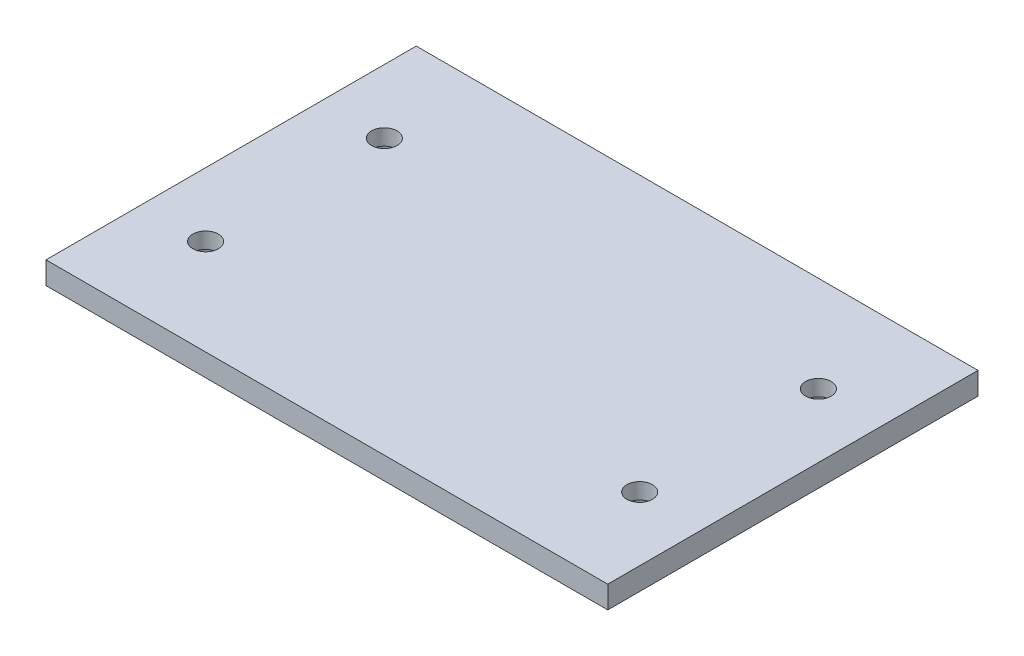
ISO-10303-21;
HEADER;
FILE_DESCRIPTION(('STEP AP214'),'2;1');
FILE_NAME('part.step','',(''),(''),'','','');
FILE_SCHEMA(('AUTOMOTIVE_DESIGN { 1 0 10303 214 1 1 1 1 }'));
ENDSEC;
DATA;
#1=APPLICATION_CONTEXT('core data for automotive mechanical design processes');
#2=APPLICATION_PROTOCOL_DEFINITION('international standard','automotive_design',2000,#1);
#3=PRODUCT_CONTEXT('',#1,'mechanical');
#4=PRODUCT('Part','Part','',(#3));
#5=PRODUCT_RELATED_PRODUCT_CATEGORY('part','',(#4));
#6=PRODUCT_DEFINITION_FORMATION('','',#4);
#7=PRODUCT_DEFINITION_CONTEXT('part definition',#1,'design');
#8=PRODUCT_DEFINITION('design','',#6,#7);
#9=PRODUCT_DEFINITION_SHAPE('','',#8);
#10=(LENGTH_UNIT() NAMED_UNIT(*) SI_UNIT(.MILLI.,.METRE.));
#11=(NAMED_UNIT(*) PLANE_ANGLE_UNIT() SI_UNIT($,.RADIAN.));
#12=(NAMED_UNIT(*) SI_UNIT($,.STERADIAN.) SOLID_ANGLE_UNIT());
#13=UNCERTAINTY_MEASURE_WITH_UNIT(LENGTH_MEASURE(1.E-05),#10,'distance_accuracy_value','');
#14=(GEOMETRIC_REPRESENTATION_CONTEXT(3) GLOBAL_UNCERTAINTY_ASSIGNED_CONTEXT((#13)) GLOBAL_UNIT_ASSIGNED_CONTEXT((#10,
#11,#12)) REPRESENTATION_CONTEXT('',''));
#15=CARTESIAN_POINT('',(0.,0.,0.));
#16=DIRECTION('',(0.,0.,1.));
#17=DIRECTION('',(1.,0.,0.));
#18=AXIS2_PLACEMENT_3D('',#15,#16,#17);
#19=CARTESIAN_POINT('',(-340.,202.,-140.));
#20=DIRECTION('',(0.,-1.,0.));
#21=DIRECTION('',(0.,0.,-1.));
#22=AXIS2_PLACEMENT_3D('',#19,#20,#21);
#23=CYLINDRICAL_SURFACE('',#22,20.);
#24=CARTESIAN_POINT('',(-340.,35.,-140.));
#25=DIRECTION('',(0.,1.,0.));
#26=DIRECTION('',(0.,0.,1.));
#27=AXIS2_PLACEMENT_3D('',#24,#25,#26);
#28=CIRCLE('',#27,20.);
#29=CARTESIAN_POINT('',(-340.,35.,-120.));
#30=VERTEX_POINT('',#29);
#31=EDGE_CURVE('E112',#30,#30,#28,.T.);
#32=ORIENTED_EDGE('',*,*,#31,.T.);
#33=EDGE_LOOP('',(#32));
#34=FACE_BOUND('',#33,.T.);
#35=CARTESIAN_POINT('',(-340.,10.,-140.));
#36=DIRECTION('',(0.,-1.,0.));
#37=DIRECTION('',(0.,0.,-1.));
#38=AXIS2_PLACEMENT_3D('',#35,#36,#37);
#39=CIRCLE('',#38,20.);
#40=CARTESIAN_POINT('',(-340.,10.,-160.));
#41=VERTEX_POINT('',#40);
#42=EDGE_CURVE('E37',#41,#41,#39,.F.);
#43=ORIENTED_EDGE('',*,*,#42,.F.);
#44=EDGE_LOOP('',(#43));
#45=FACE_BOUND('',#44,.T.);
#46=ADVANCED_FACE('F33',(#34,#45),#23,.F.);
#47=CARTESIAN_POINT('',(340.,202.,-140.));
#48=DIRECTION('',(0.,-1.,0.));
#49=DIRECTION('',(0.,0.,-1.));
#50=AXIS2_PLACEMENT_3D('',#47,#48,#49);
#51=CYLINDRICAL_SURFACE('',#50,20.);
#52=CARTESIAN_POINT('',(340.,35.,-140.));
#53=DIRECTION('',(0.,1.,0.));
#54=DIRECTION('',(0.,0.,1.));
#55=AXIS2_PLACEMENT_3D('',#52,#53,#54);
#56=CIRCLE('',#55,20.);
#57=CARTESIAN_POINT('',(340.,35.,-120.));
#58=VERTEX_POINT('',#57);
#59=EDGE_CURVE('E145',#58,#58,#56,.T.);
#60=ORIENTED_EDGE('',*,*,#59,.T.);
#61=EDGE_LOOP('',(#60));
#62=FACE_BOUND('',#61,.T.);
#63=CARTESIAN_POINT('',(340.,10.,-140.));
#64=DIRECTION('',(0.,-1.,0.));
#65=DIRECTION('',(0.,0.,-1.));
#66=AXIS2_PLACEMENT_3D('',#63,#64,#65);
#67=CIRCLE('',#66,20.);
#68=CARTESIAN_POINT('',(340.,10.,-160.));
#69=VERTEX_POINT('',#68);
#70=EDGE_CURVE('E118',#69,#69,#67,.F.);
#71=ORIENTED_EDGE('',*,*,#70,.F.);
#72=EDGE_LOOP('',(#71));
#73=FACE_BOUND('',#72,.T.);
#74=ADVANCED_FACE('F174',(#62,#73),#51,.F.);
#75=CARTESIAN_POINT('',(340.,202.,140.));
#76=DIRECTION('',(0.,-1.,0.));
#77=DIRECTION('',(0.,0.,-1.));
#78=AXIS2_PLACEMENT_3D('',#75,#76,#77);
#79=CYLINDRICAL_SURFACE('',#78,20.);
#80=CARTESIAN_POINT('',(340.,35.,140.));
#81=DIRECTION('',(0.,1.,0.));
#82=DIRECTION('',(0.,0.,1.));
#83=AXIS2_PLACEMENT_3D('',#80,#81,#82);
#84=CIRCLE('',#83,20.);
#85=CARTESIAN_POINT('',(340.,35.,160.));
#86=VERTEX_POINT('',#85);
#87=EDGE_CURVE('E148',#86,#86,#84,.T.);
#88=ORIENTED_EDGE('',*,*,#87,.T.);
#89=EDGE_LOOP('',(#88));
#90=FACE_BOUND('',#89,.T.);
#91=CARTESIAN_POINT('',(340.,10.,140.));
#92=DIRECTION('',(0.,-1.,0.));
#93=DIRECTION('',(0.,0.,-1.));
#94=AXIS2_PLACEMENT_3D('',#91,#92,#93);
#95=CIRCLE('',#94,20.);
#96=CARTESIAN_POINT('',(340.,10.,120.));
#97=VERTEX_POINT('',#96);
#98=EDGE_CURVE('E114',#97,#97,#95,.F.);
#99=ORIENTED_EDGE('',*,*,#98,.F.);
#100=EDGE_LOOP('',(#99));
#101=FACE_BOUND('',#100,.T.);
#102=ADVANCED_FACE('F180',(#90,#101),#79,.F.);
#103=CARTESIAN_POINT('',(-340.,202.,140.));
#104=DIRECTION('',(0.,-1.,0.));
#105=DIRECTION('',(0.,0.,-1.));
#106=AXIS2_PLACEMENT_3D('',#103,#104,#105);
#107=CYLINDRICAL_SURFACE('',#106,20.);
#108=CARTESIAN_POINT('',(-340.,35.,140.));
#109=DIRECTION('',(0.,1.,0.));
#110=DIRECTION('',(0.,0.,1.));
#111=AXIS2_PLACEMENT_3D('',#108,#109,#110);
#112=CIRCLE('',#111,20.);
#113=CARTESIAN_POINT('',(-340.,35.,160.));
#114=VERTEX_POINT('',#113);
#115=EDGE_CURVE('E103',#114,#114,#112,.T.);
#116=ORIENTED_EDGE('',*,*,#115,.T.);
#117=EDGE_LOOP('',(#116));
#118=FACE_BOUND('',#117,.T.);
#119=CARTESIAN_POINT('',(-340.,10.,140.));
#120=DIRECTION('',(0.,-1.,0.));
#121=DIRECTION('',(0.,0.,-1.));
#122=AXIS2_PLACEMENT_3D('',#119,#120,#121);
#123=CIRCLE('',#122,20.);
#124=CARTESIAN_POINT('',(-340.,10.,120.));
#125=VERTEX_POINT('',#124);
#126=EDGE_CURVE('E109',#125,#125,#123,.F.);
#127=ORIENTED_EDGE('',*,*,#126,.F.);
#128=EDGE_LOOP('',(#127));
#129=FACE_BOUND('',#128,.T.);
#130=ADVANCED_FACE('F154',(#118,#129),#107,.F.);
#131=CARTESIAN_POINT('',(440.,35.,-290.));
#132=DIRECTION('',(-1.,0.,0.));
#133=DIRECTION('',(0.,0.,1.));
#134=AXIS2_PLACEMENT_3D('',#131,#132,#133);
#135=PLANE('',#134);
#136=DIRECTION('',(0.,0.,-1.));
#137=VECTOR('',#136,1.);
#138=CARTESIAN_POINT('',(440.,0.,-290.));
#139=LINE('',#138,#137);
#140=CARTESIAN_POINT('',(440.,0.,290.));
#141=VERTEX_POINT('',#140);
#142=CARTESIAN_POINT('',(440.,0.,-290.));
#143=VERTEX_POINT('',#142);
#144=EDGE_CURVE('E100',#141,#143,#139,.T.);
#145=ORIENTED_EDGE('',*,*,#144,.T.);
#146=DIRECTION('',(0.,-1.,0.));
#147=VECTOR('',#146,1.);
#148=CARTESIAN_POINT('',(440.,35.,-290.));
#149=LINE('',#148,#147);
#150=CARTESIAN_POINT('',(440.,35.,-290.));
#151=VERTEX_POINT('',#150);
#152=EDGE_CURVE('E11',#151,#143,#149,.T.);
#153=ORIENTED_EDGE('',*,*,#152,.F.);
#154=DIRECTION('',(0.,0.,-1.));
#155=VECTOR('',#154,1.);
#156=CARTESIAN_POINT('',(440.,35.,-290.));
#157=LINE('',#156,#155);
#158=CARTESIAN_POINT('',(440.,35.,290.));
#159=VERTEX_POINT('',#158);
#160=EDGE_CURVE('E87',#159,#151,#157,.T.);
#161=ORIENTED_EDGE('',*,*,#160,.F.);
#162=DIRECTION('',(0.,-1.,0.));
#163=VECTOR('',#162,1.);
#164=CARTESIAN_POINT('',(440.,35.,290.));
#165=LINE('',#164,#163);
#166=EDGE_CURVE('E96',#159,#141,#165,.T.);
#167=ORIENTED_EDGE('',*,*,#166,.T.);
#168=EDGE_LOOP('',(#145,#153,#161,#167));
#169=FACE_BOUND('',#168,.T.);
#170=ADVANCED_FACE('F35',(#169),#135,.F.);
#171=CARTESIAN_POINT('',(-440.,35.,-290.));
#172=DIRECTION('',(0.,0.,1.));
#173=DIRECTION('',(1.,0.,0.));
#174=AXIS2_PLACEMENT_3D('',#171,#172,#173);
#175=PLANE('',#174);
#176=DIRECTION('',(-1.,0.,0.));
#177=VECTOR('',#176,1.);
#178=CARTESIAN_POINT('',(-440.,0.,-290.));
#179=LINE('',#178,#177);
#180=CARTESIAN_POINT('',(-440.,0.,-290.));
#181=VERTEX_POINT('',#180);
#182=EDGE_CURVE('E91',#143,#181,#179,.T.);
#183=ORIENTED_EDGE('',*,*,#182,.T.);
#184=DIRECTION('',(0.,-1.,0.));
#185=VECTOR('',#184,1.);
#186=CARTESIAN_POINT('',(-440.,35.,-290.));
#187=LINE('',#186,#185);
#188=CARTESIAN_POINT('',(-440.,35.,-290.));
#189=VERTEX_POINT('',#188);
#190=EDGE_CURVE('E43',#189,#181,#187,.T.);
#191=ORIENTED_EDGE('',*,*,#190,.F.);
#192=DIRECTION('',(-1.,0.,0.));
#193=VECTOR('',#192,1.);
#194=CARTESIAN_POINT('',(-440.,35.,-290.));
#195=LINE('',#194,#193);
#196=EDGE_CURVE('E82',#151,#189,#195,.T.);
#197=ORIENTED_EDGE('',*,*,#196,.F.);
#198=ORIENTED_EDGE('',*,*,#152,.T.);
#199=EDGE_LOOP('',(#183,#191,#197,#198));
#200=FACE_BOUND('',#199,.T.);
#201=ADVANCED_FACE('F90',(#200),#175,.F.);
#202=CARTESIAN_POINT('',(-440.,35.,-290.));
#203=DIRECTION('',(1.,0.,0.));
#204=DIRECTION('',(0.,0.,-1.));
#205=AXIS2_PLACEMENT_3D('',#202,#203,#204);
#206=PLANE('',#205);
#207=DIRECTION('',(0.,0.,1.));
#208=VECTOR('',#207,1.);
#209=CARTESIAN_POINT('',(-440.,0.,-290.));
#210=LINE('',#209,#208);
#211=CARTESIAN_POINT('',(-440.,0.,290.));
#212=VERTEX_POINT('',#211);
#213=EDGE_CURVE('E69',#181,#212,#210,.T.);
#214=ORIENTED_EDGE('',*,*,#213,.T.);
#215=DIRECTION('',(0.,-1.,0.));
#216=VECTOR('',#215,1.);
#217=CARTESIAN_POINT('',(-440.,35.,290.));
#218=LINE('',#217,#216);
#219=CARTESIAN_POINT('',(-440.,35.,290.));
#220=VERTEX_POINT('',#219);
#221=EDGE_CURVE('E92',#220,#212,#218,.T.);
#222=ORIENTED_EDGE('',*,*,#221,.F.);
#223=DIRECTION('',(0.,0.,1.));
#224=VECTOR('',#223,1.);
#225=CARTESIAN_POINT('',(-440.,35.,-290.));
#226=LINE('',#225,#224);
#227=EDGE_CURVE('E85',#189,#220,#226,.T.);
#228=ORIENTED_EDGE('',*,*,#227,.F.);
#229=ORIENTED_EDGE('',*,*,#190,.T.);
#230=EDGE_LOOP('',(#214,#222,#228,#229));
#231=FACE_BOUND('',#230,.T.);
#232=ADVANCED_FACE('F94',(#231),#206,.F.);
#233=CARTESIAN_POINT('',(-440.,35.,290.));
#234=DIRECTION('',(0.,0.,-1.));
#235=DIRECTION('',(-1.,0.,0.));
#236=AXIS2_PLACEMENT_3D('',#233,#234,#235);
#237=PLANE('',#236);
#238=DIRECTION('',(1.,0.,0.));
#239=VECTOR('',#238,1.);
#240=CARTESIAN_POINT('',(-440.,0.,290.));
#241=LINE('',#240,#239);
#242=EDGE_CURVE('E75',#212,#141,#241,.T.);
#243=ORIENTED_EDGE('',*,*,#242,.T.);
#244=ORIENTED_EDGE('',*,*,#166,.F.);
#245=DIRECTION('',(1.,0.,0.));
#246=VECTOR('',#245,1.);
#247=CARTESIAN_POINT('',(-440.,35.,290.));
#248=LINE('',#247,#246);
#249=EDGE_CURVE('E52',#220,#159,#248,.T.);
#250=ORIENTED_EDGE('',*,*,#249,.F.);
#251=ORIENTED_EDGE('',*,*,#221,.T.);
#252=EDGE_LOOP('',(#243,#244,#250,#251));
#253=FACE_BOUND('',#252,.T.);
#254=ADVANCED_FACE('F159',(#253),#237,.F.);
#255=CARTESIAN_POINT('',(0.,35.,0.));
#256=DIRECTION('',(0.,1.,0.));
#257=DIRECTION('',(0.,0.,1.));
#258=AXIS2_PLACEMENT_3D('',#255,#256,#257);
#259=PLANE('',#258);
#260=ORIENTED_EDGE('',*,*,#31,.F.);
#261=EDGE_LOOP('',(#260));
#262=FACE_BOUND('',#261,.T.);
#263=ORIENTED_EDGE('',*,*,#59,.F.);
#264=EDGE_LOOP('',(#263));
#265=FACE_BOUND('',#264,.T.);
#266=ORIENTED_EDGE('',*,*,#87,.F.);
#267=EDGE_LOOP('',(#266));
#268=FACE_BOUND('',#267,.T.);
#269=ORIENTED_EDGE('',*,*,#115,.F.);
#270=EDGE_LOOP('',(#269));
#271=FACE_BOUND('',#270,.T.);
#272=ORIENTED_EDGE('',*,*,#160,.T.);
#273=ORIENTED_EDGE('',*,*,#196,.T.);
#274=ORIENTED_EDGE('',*,*,#227,.T.);
#275=ORIENTED_EDGE('',*,*,#249,.T.);
#276=EDGE_LOOP('',(#272,#273,#274,#275));
#277=FACE_BOUND('',#276,.T.);
#278=ADVANCED_FACE('F83',(#262,#265,#268,#271,#277),#259,.T.);
#279=CARTESIAN_POINT('',(0.,0.,0.));
#280=DIRECTION('',(0.,1.,0.));
#281=DIRECTION('',(0.,0.,1.));
#282=AXIS2_PLACEMENT_3D('',#279,#280,#281);
#283=PLANE('',#282);
#284=CARTESIAN_POINT('',(-340.,0.,-140.));
#285=DIRECTION('',(0.,-1.,0.));
#286=DIRECTION('',(0.,0.,-1.));
#287=AXIS2_PLACEMENT_3D('',#284,#285,#286);
#288=CIRCLE('',#287,25.);
#289=CARTESIAN_POINT('',(-340.,0.,-165.));
#290=VERTEX_POINT('',#289);
#291=EDGE_CURVE('E134',#290,#290,#288,.T.);
#292=ORIENTED_EDGE('',*,*,#291,.F.);
#293=EDGE_LOOP('',(#292));
#294=FACE_BOUND('',#293,.T.);
#295=CARTESIAN_POINT('',(340.,0.,-140.));
#296=DIRECTION('',(0.,-1.,0.));
#297=DIRECTION('',(0.,0.,-1.));
#298=AXIS2_PLACEMENT_3D('',#295,#296,#297);
#299=CIRCLE('',#298,25.);
#300=CARTESIAN_POINT('',(340.,0.,-165.));
#301=VERTEX_POINT('',#300);
#302=EDGE_CURVE('E127',#301,#301,#299,.T.);
#303=ORIENTED_EDGE('',*,*,#302,.F.);
#304=EDGE_LOOP('',(#303));
#305=FACE_BOUND('',#304,.T.);
#306=CARTESIAN_POINT('',(340.,0.,140.));
#307=DIRECTION('',(0.,-1.,0.));
#308=DIRECTION('',(0.,0.,-1.));
#309=AXIS2_PLACEMENT_3D('',#306,#307,#308);
#310=CIRCLE('',#309,25.);
#311=CARTESIAN_POINT('',(340.,0.,115.));
#312=VERTEX_POINT('',#311);
#313=EDGE_CURVE('E120',#312,#312,#310,.T.);
#314=ORIENTED_EDGE('',*,*,#313,.F.);
#315=EDGE_LOOP('',(#314));
#316=FACE_BOUND('',#315,.T.);
#317=CARTESIAN_POINT('',(-340.,0.,140.));
#318=DIRECTION('',(0.,-1.,0.));
#319=DIRECTION('',(0.,0.,-1.));
#320=AXIS2_PLACEMENT_3D('',#317,#318,#319);
#321=CIRCLE('',#320,25.);
#322=CARTESIAN_POINT('',(-340.,0.,115.));
#323=VERTEX_POINT('',#322);
#324=EDGE_CURVE('E116',#323,#323,#321,.T.);
#325=ORIENTED_EDGE('',*,*,#324,.F.);
#326=EDGE_LOOP('',(#325));
#327=FACE_BOUND('',#326,.T.);
#328=ORIENTED_EDGE('',*,*,#144,.F.);
#329=ORIENTED_EDGE('',*,*,#242,.F.);
#330=ORIENTED_EDGE('',*,*,#213,.F.);
#331=ORIENTED_EDGE('',*,*,#182,.F.);
#332=EDGE_LOOP('',(#328,#329,#330,#331));
#333=FACE_BOUND('',#332,.T.);
#334=ADVANCED_FACE('F158',(#294,#305,#316,#327,#333),#283,.F.);
#335=CARTESIAN_POINT('',(-340.,10.,140.));
#336=DIRECTION('',(0.,-1.,0.));
#337=DIRECTION('',(0.,0.,-1.));
#338=AXIS2_PLACEMENT_3D('',#335,#336,#337);
#339=PLANE('',#338);
#340=CARTESIAN_POINT('',(-340.,10.,140.));
#341=DIRECTION('',(0.,-1.,0.));
#342=DIRECTION('',(0.,0.,-1.));
#343=AXIS2_PLACEMENT_3D('',#340,#341,#342);
#344=CIRCLE('',#343,25.);
#345=CARTESIAN_POINT('',(-340.,10.,115.));
#346=VERTEX_POINT('',#345);
#347=EDGE_CURVE('E113',#346,#346,#344,.T.);
#348=ORIENTED_EDGE('',*,*,#347,.T.);
#349=EDGE_LOOP('',(#348));
#350=FACE_BOUND('',#349,.T.);
#351=ORIENTED_EDGE('',*,*,#126,.T.);
#352=EDGE_LOOP('',(#351));
#353=FACE_BOUND('',#352,.T.);
#354=ADVANCED_FACE('F166',(#350,#353),#339,.T.);
#355=CARTESIAN_POINT('',(-340.,10.,140.));
#356=DIRECTION('',(0.,-1.,0.));
#357=DIRECTION('',(0.,0.,-1.));
#358=AXIS2_PLACEMENT_3D('',#355,#356,#357);
#359=CYLINDRICAL_SURFACE('',#358,25.);
#360=ORIENTED_EDGE('',*,*,#347,.F.);
#361=EDGE_LOOP('',(#360));
#362=FACE_BOUND('',#361,.T.);
#363=ORIENTED_EDGE('',*,*,#324,.T.);
#364=EDGE_LOOP('',(#363));
#365=FACE_BOUND('',#364,.T.);
#366=ADVANCED_FACE('F185',(#362,#365),#359,.F.);
#367=CARTESIAN_POINT('',(340.,10.,140.));
#368=DIRECTION('',(0.,-1.,0.));
#369=DIRECTION('',(0.,0.,-1.));
#370=AXIS2_PLACEMENT_3D('',#367,#368,#369);
#371=PLANE('',#370);
#372=CARTESIAN_POINT('',(340.,10.,140.));
#373=DIRECTION('',(0.,-1.,0.));
#374=DIRECTION('',(0.,0.,-1.));
#375=AXIS2_PLACEMENT_3D('',#372,#373,#374);
#376=CIRCLE('',#375,25.);
#377=CARTESIAN_POINT('',(340.,10.,115.));
#378=VERTEX_POINT('',#377);
#379=EDGE_CURVE('E117',#378,#378,#376,.T.);
#380=ORIENTED_EDGE('',*,*,#379,.T.);
#381=EDGE_LOOP('',(#380));
#382=FACE_BOUND('',#381,.T.);
#383=ORIENTED_EDGE('',*,*,#98,.T.);
#384=EDGE_LOOP('',(#383));
#385=FACE_BOUND('',#384,.T.);
#386=ADVANCED_FACE('F257',(#382,#385),#371,.T.);
#387=CARTESIAN_POINT('',(340.,10.,140.));
#388=DIRECTION('',(0.,-1.,0.));
#389=DIRECTION('',(0.,0.,-1.));
#390=AXIS2_PLACEMENT_3D('',#387,#388,#389);
#391=CYLINDRICAL_SURFACE('',#390,25.);
#392=ORIENTED_EDGE('',*,*,#379,.F.);
#393=EDGE_LOOP('',(#392));
#394=FACE_BOUND('',#393,.T.);
#395=ORIENTED_EDGE('',*,*,#313,.T.);
#396=EDGE_LOOP('',(#395));
#397=FACE_BOUND('',#396,.T.);
#398=ADVANCED_FACE('F266',(#394,#397),#391,.F.);
#399=CARTESIAN_POINT('',(340.,10.,-140.));
#400=DIRECTION('',(0.,-1.,0.));
#401=DIRECTION('',(0.,0.,-1.));
#402=AXIS2_PLACEMENT_3D('',#399,#400,#401);
#403=PLANE('',#402);
#404=CARTESIAN_POINT('',(340.,10.,-140.));
#405=DIRECTION('',(0.,-1.,0.));
#406=DIRECTION('',(0.,0.,-1.));
#407=AXIS2_PLACEMENT_3D('',#404,#405,#406);
#408=CIRCLE('',#407,25.);
#409=CARTESIAN_POINT('',(340.,10.,-165.));
#410=VERTEX_POINT('',#409);
#411=EDGE_CURVE('E121',#410,#410,#408,.T.);
#412=ORIENTED_EDGE('',*,*,#411,.T.);
#413=EDGE_LOOP('',(#412));
#414=FACE_BOUND('',#413,.T.);
#415=ORIENTED_EDGE('',*,*,#70,.T.);
#416=EDGE_LOOP('',(#415));
#417=FACE_BOUND('',#416,.T.);
#418=ADVANCED_FACE('F276',(#414,#417),#403,.T.);
#419=CARTESIAN_POINT('',(340.,10.,-140.));
#420=DIRECTION('',(0.,-1.,0.));
#421=DIRECTION('',(0.,0.,-1.));
#422=AXIS2_PLACEMENT_3D('',#419,#420,#421);
#423=CYLINDRICAL_SURFACE('',#422,25.);
#424=ORIENTED_EDGE('',*,*,#411,.F.);
#425=EDGE_LOOP('',(#424));
#426=FACE_BOUND('',#425,.T.);
#427=ORIENTED_EDGE('',*,*,#302,.T.);
#428=EDGE_LOOP('',(#427));
#429=FACE_BOUND('',#428,.T.);
#430=ADVANCED_FACE('F286',(#426,#429),#423,.F.);
#431=CARTESIAN_POINT('',(-340.,10.,-140.));
#432=DIRECTION('',(0.,-1.,0.));
#433=DIRECTION('',(0.,0.,-1.));
#434=AXIS2_PLACEMENT_3D('',#431,#432,#433);
#435=PLANE('',#434);
#436=CARTESIAN_POINT('',(-340.,10.,-140.));
#437=DIRECTION('',(0.,-1.,0.));
#438=DIRECTION('',(0.,0.,-1.));
#439=AXIS2_PLACEMENT_3D('',#436,#437,#438);
#440=CIRCLE('',#439,25.);
#441=CARTESIAN_POINT('',(-340.,10.,-165.));
#442=VERTEX_POINT('',#441);
#443=EDGE_CURVE('E322',#442,#442,#440,.T.);
#444=ORIENTED_EDGE('',*,*,#443,.T.);
#445=EDGE_LOOP('',(#444));
#446=FACE_BOUND('',#445,.T.);
#447=ORIENTED_EDGE('',*,*,#42,.T.);
#448=EDGE_LOOP('',(#447));
#449=FACE_BOUND('',#448,.T.);
#450=ADVANCED_FACE('F295',(#446,#449),#435,.T.);
#451=CARTESIAN_POINT('',(-340.,10.,-140.));
#452=DIRECTION('',(0.,-1.,0.));
#453=DIRECTION('',(0.,0.,-1.));
#454=AXIS2_PLACEMENT_3D('',#451,#452,#453);
#455=CYLINDRICAL_SURFACE('',#454,25.);
#456=ORIENTED_EDGE('',*,*,#443,.F.);
#457=EDGE_LOOP('',(#456));
#458=FACE_BOUND('',#457,.T.);
#459=ORIENTED_EDGE('',*,*,#291,.T.);
#460=EDGE_LOOP('',(#459));
#461=FACE_BOUND('',#460,.T.);
#462=ADVANCED_FACE('F305',(#458,#461),#455,.F.);
#463=CLOSED_SHELL('',(#46,#74,#102,#130,#170,#201,#232,#254,#278,#334,#354,#366,#386,#398,#418,
#430,#450,#462));
#464=MANIFOLD_SOLID_BREP('B2',#463);
#465=ADVANCED_BREP_SHAPE_REPRESENTATION('',(#18,#464),#14);
#466=SHAPE_DEFINITION_REPRESENTATION(#9,#465);
ENDSEC;
END-ISO-10303-21;
